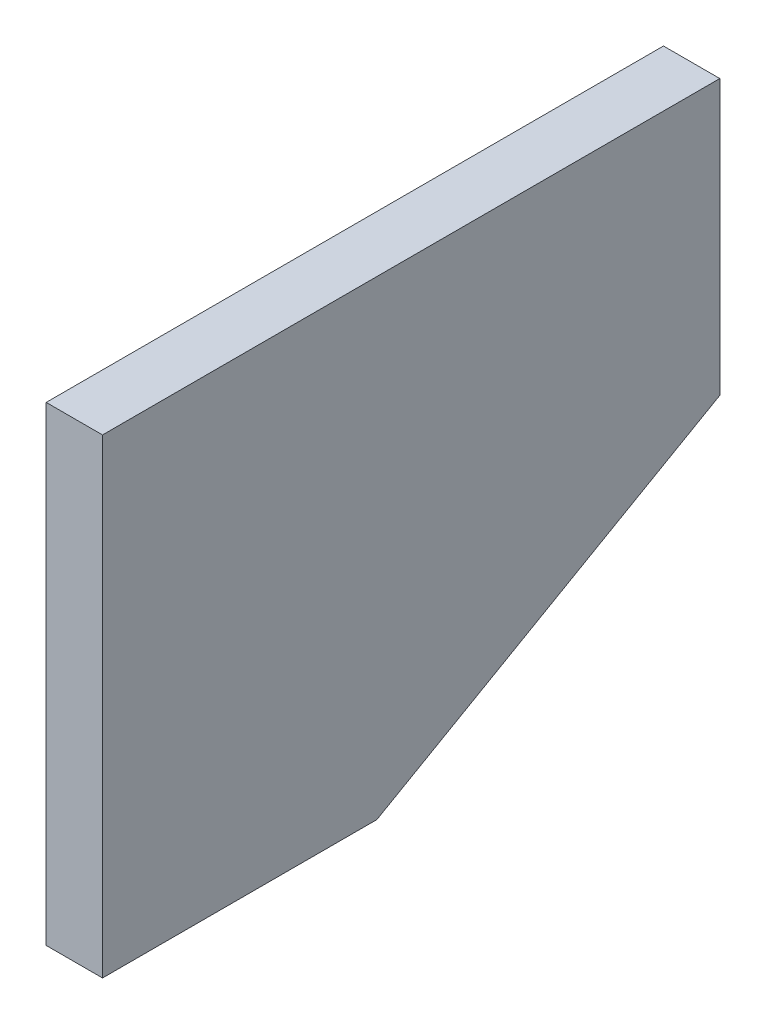
ISO-10303-21;
HEADER;
FILE_DESCRIPTION(('STEP AP214'),'2;1');
FILE_NAME('part.step','',(''),(''),'','','');
FILE_SCHEMA(('AUTOMOTIVE_DESIGN { 1 0 10303 214 1 1 1 1 }'));
ENDSEC;
DATA;
#1=APPLICATION_CONTEXT('core data for automotive mechanical design processes');
#2=APPLICATION_PROTOCOL_DEFINITION('international standard','automotive_design',2000,#1);
#3=PRODUCT_CONTEXT('',#1,'mechanical');
#4=PRODUCT('Part','Part','',(#3));
#5=PRODUCT_RELATED_PRODUCT_CATEGORY('part','',(#4));
#6=PRODUCT_DEFINITION_FORMATION('','',#4);
#7=PRODUCT_DEFINITION_CONTEXT('part definition',#1,'design');
#8=PRODUCT_DEFINITION('design','',#6,#7);
#9=PRODUCT_DEFINITION_SHAPE('','',#8);
#10=(LENGTH_UNIT() NAMED_UNIT(*) SI_UNIT(.MILLI.,.METRE.));
#11=(NAMED_UNIT(*) PLANE_ANGLE_UNIT() SI_UNIT($,.RADIAN.));
#12=(NAMED_UNIT(*) SI_UNIT($,.STERADIAN.) SOLID_ANGLE_UNIT());
#13=UNCERTAINTY_MEASURE_WITH_UNIT(LENGTH_MEASURE(1.E-05),#10,'distance_accuracy_value','');
#14=(GEOMETRIC_REPRESENTATION_CONTEXT(3) GLOBAL_UNCERTAINTY_ASSIGNED_CONTEXT((#13)) GLOBAL_UNIT_ASSIGNED_CONTEXT((#10,
#11,#12)) REPRESENTATION_CONTEXT('',''));
#15=CARTESIAN_POINT('',(0.,0.,0.));
#16=DIRECTION('',(0.,0.,1.));
#17=DIRECTION('',(1.,0.,0.));
#18=AXIS2_PLACEMENT_3D('',#15,#16,#17);
#19=CARTESIAN_POINT('',(18.25625,-152.4,0.));
#20=DIRECTION('',(0.,0.,-1.));
#21=DIRECTION('',(-1.,0.,0.));
#22=AXIS2_PLACEMENT_3D('',#19,#20,#21);
#23=PLANE('',#22);
#24=DIRECTION('',(0.,-1.,0.));
#25=VECTOR('',#24,1.);
#26=CARTESIAN_POINT('',(0.,-152.4,0.));
#27=LINE('',#26,#25);
#28=CARTESIAN_POINT('',(0.,0.,0.));
#29=VERTEX_POINT('',#28);
#30=CARTESIAN_POINT('',(0.,-152.4,0.));
#31=VERTEX_POINT('',#30);
#32=EDGE_CURVE('E107',#29,#31,#27,.T.);
#33=ORIENTED_EDGE('',*,*,#32,.T.);
#34=DIRECTION('',(-1.,0.,0.));
#35=VECTOR('',#34,1.);
#36=CARTESIAN_POINT('',(18.25625,-152.4,0.));
#37=LINE('',#36,#35);
#38=CARTESIAN_POINT('',(18.25625,-152.4,0.));
#39=VERTEX_POINT('',#38);
#40=EDGE_CURVE('E11',#39,#31,#37,.T.);
#41=ORIENTED_EDGE('',*,*,#40,.F.);
#42=DIRECTION('',(0.,-1.,0.));
#43=VECTOR('',#42,1.);
#44=CARTESIAN_POINT('',(18.25625,-152.4,0.));
#45=LINE('',#44,#43);
#46=CARTESIAN_POINT('',(18.25625,0.,0.));
#47=VERTEX_POINT('',#46);
#48=EDGE_CURVE('E115',#47,#39,#45,.T.);
#49=ORIENTED_EDGE('',*,*,#48,.F.);
#50=DIRECTION('',(-1.,0.,0.));
#51=VECTOR('',#50,1.);
#52=CARTESIAN_POINT('',(18.25625,0.,0.));
#53=LINE('',#52,#51);
#54=EDGE_CURVE('E103',#47,#29,#53,.T.);
#55=ORIENTED_EDGE('',*,*,#54,.T.);
#56=EDGE_LOOP('',(#33,#41,#49,#55));
#57=FACE_BOUND('',#56,.T.);
#58=ADVANCED_FACE('F33',(#57),#23,.F.);
#59=CARTESIAN_POINT('',(18.25625,-152.4,-88.9));
#60=DIRECTION('',(0.,1.,0.));
#61=DIRECTION('',(0.,0.,1.));
#62=AXIS2_PLACEMENT_3D('',#59,#60,#61);
#63=PLANE('',#62);
#64=DIRECTION('',(0.,0.,-1.));
#65=VECTOR('',#64,1.);
#66=CARTESIAN_POINT('',(0.,-152.4,-88.9));
#67=LINE('',#66,#65);
#68=CARTESIAN_POINT('',(0.,-152.4,-88.9));
#69=VERTEX_POINT('',#68);
#70=EDGE_CURVE('E110',#31,#69,#67,.T.);
#71=ORIENTED_EDGE('',*,*,#70,.T.);
#72=DIRECTION('',(-1.,0.,0.));
#73=VECTOR('',#72,1.);
#74=CARTESIAN_POINT('',(18.25625,-152.4,-88.9));
#75=LINE('',#74,#73);
#76=CARTESIAN_POINT('',(18.25625,-152.4,-88.9));
#77=VERTEX_POINT('',#76);
#78=EDGE_CURVE('E41',#77,#69,#75,.T.);
#79=ORIENTED_EDGE('',*,*,#78,.F.);
#80=DIRECTION('',(0.,0.,-1.));
#81=VECTOR('',#80,1.);
#82=CARTESIAN_POINT('',(18.25625,-152.4,-88.9));
#83=LINE('',#82,#81);
#84=EDGE_CURVE('E83',#39,#77,#83,.T.);
#85=ORIENTED_EDGE('',*,*,#84,.F.);
#86=ORIENTED_EDGE('',*,*,#40,.T.);
#87=EDGE_LOOP('',(#71,#79,#85,#86));
#88=FACE_BOUND('',#87,.T.);
#89=ADVANCED_FACE('F134',(#88),#63,.F.);
#90=CARTESIAN_POINT('',(18.25625,-88.9,-200.025));
#91=DIRECTION('',(0.,0.868243142124459,0.496138938356834));
#92=DIRECTION('',(0.,-0.496138938356834,0.868243142124459));
#93=AXIS2_PLACEMENT_3D('',#90,#91,#92);
#94=PLANE('',#93);
#95=DIRECTION('',(0.,0.496138938356834,-0.868243142124459));
#96=VECTOR('',#95,1.);
#97=CARTESIAN_POINT('',(0.,-88.9,-200.025));
#98=LINE('',#97,#96);
#99=CARTESIAN_POINT('',(0.,-88.9,-200.025));
#100=VERTEX_POINT('',#99);
#101=EDGE_CURVE('E98',#69,#100,#98,.T.);
#102=ORIENTED_EDGE('',*,*,#101,.T.);
#103=DIRECTION('',(-1.,0.,0.));
#104=VECTOR('',#103,1.);
#105=CARTESIAN_POINT('',(18.25625,-88.9,-200.025));
#106=LINE('',#105,#104);
#107=CARTESIAN_POINT('',(18.25625,-88.9,-200.025));
#108=VERTEX_POINT('',#107);
#109=EDGE_CURVE('E95',#108,#100,#106,.T.);
#110=ORIENTED_EDGE('',*,*,#109,.F.);
#111=DIRECTION('',(0.,0.496138938356834,-0.868243142124459));
#112=VECTOR('',#111,1.);
#113=CARTESIAN_POINT('',(18.25625,-88.9,-200.025));
#114=LINE('',#113,#112);
#115=EDGE_CURVE('E87',#77,#108,#114,.T.);
#116=ORIENTED_EDGE('',*,*,#115,.F.);
#117=ORIENTED_EDGE('',*,*,#78,.T.);
#118=EDGE_LOOP('',(#102,#110,#116,#117));
#119=FACE_BOUND('',#118,.T.);
#120=ADVANCED_FACE('F96',(#119),#94,.F.);
#121=CARTESIAN_POINT('',(18.25625,0.,-200.025));
#122=DIRECTION('',(0.,0.,1.));
#123=DIRECTION('',(1.,0.,0.));
#124=AXIS2_PLACEMENT_3D('',#121,#122,#123);
#125=PLANE('',#124);
#126=DIRECTION('',(0.,1.,0.));
#127=VECTOR('',#126,1.);
#128=CARTESIAN_POINT('',(0.,0.,-200.025));
#129=LINE('',#128,#127);
#130=CARTESIAN_POINT('',(0.,0.,-200.025));
#131=VERTEX_POINT('',#130);
#132=EDGE_CURVE('E69',#100,#131,#129,.T.);
#133=ORIENTED_EDGE('',*,*,#132,.T.);
#134=DIRECTION('',(-1.,0.,0.));
#135=VECTOR('',#134,1.);
#136=CARTESIAN_POINT('',(18.25625,0.,-200.025));
#137=LINE('',#136,#135);
#138=CARTESIAN_POINT('',(18.25625,0.,-200.025));
#139=VERTEX_POINT('',#138);
#140=EDGE_CURVE('E99',#139,#131,#137,.T.);
#141=ORIENTED_EDGE('',*,*,#140,.F.);
#142=DIRECTION('',(0.,1.,0.));
#143=VECTOR('',#142,1.);
#144=CARTESIAN_POINT('',(18.25625,0.,-200.025));
#145=LINE('',#144,#143);
#146=EDGE_CURVE('E91',#108,#139,#145,.T.);
#147=ORIENTED_EDGE('',*,*,#146,.F.);
#148=ORIENTED_EDGE('',*,*,#109,.T.);
#149=EDGE_LOOP('',(#133,#141,#147,#148));
#150=FACE_BOUND('',#149,.T.);
#151=ADVANCED_FACE('F101',(#150),#125,.F.);
#152=CARTESIAN_POINT('',(18.25625,0.,0.));
#153=DIRECTION('',(0.,-1.,0.));
#154=DIRECTION('',(0.,0.,-1.));
#155=AXIS2_PLACEMENT_3D('',#152,#153,#154);
#156=PLANE('',#155);
#157=DIRECTION('',(0.,0.,1.));
#158=VECTOR('',#157,1.);
#159=CARTESIAN_POINT('',(0.,0.,0.));
#160=LINE('',#159,#158);
#161=EDGE_CURVE('E75',#131,#29,#160,.T.);
#162=ORIENTED_EDGE('',*,*,#161,.T.);
#163=ORIENTED_EDGE('',*,*,#54,.F.);
#164=DIRECTION('',(0.,0.,1.));
#165=VECTOR('',#164,1.);
#166=CARTESIAN_POINT('',(18.25625,0.,0.));
#167=LINE('',#166,#165);
#168=EDGE_CURVE('E49',#139,#47,#167,.T.);
#169=ORIENTED_EDGE('',*,*,#168,.F.);
#170=ORIENTED_EDGE('',*,*,#140,.T.);
#171=EDGE_LOOP('',(#162,#163,#169,#170));
#172=FACE_BOUND('',#171,.T.);
#173=ADVANCED_FACE('F123',(#172),#156,.F.);
#174=CARTESIAN_POINT('',(18.25625,0.,0.));
#175=DIRECTION('',(-1.,0.,0.));
#176=DIRECTION('',(0.,0.,1.));
#177=AXIS2_PLACEMENT_3D('',#174,#175,#176);
#178=PLANE('',#177);
#179=ORIENTED_EDGE('',*,*,#48,.T.);
#180=ORIENTED_EDGE('',*,*,#84,.T.);
#181=ORIENTED_EDGE('',*,*,#115,.T.);
#182=ORIENTED_EDGE('',*,*,#146,.T.);
#183=ORIENTED_EDGE('',*,*,#168,.T.);
#184=EDGE_LOOP('',(#179,#180,#181,#182,#183));
#185=FACE_BOUND('',#184,.T.);
#186=ADVANCED_FACE('F89',(#185),#178,.F.);
#187=CARTESIAN_POINT('',(0.,0.,0.));
#188=DIRECTION('',(-1.,0.,0.));
#189=DIRECTION('',(0.,0.,1.));
#190=AXIS2_PLACEMENT_3D('',#187,#188,#189);
#191=PLANE('',#190);
#192=ORIENTED_EDGE('',*,*,#32,.F.);
#193=ORIENTED_EDGE('',*,*,#161,.F.);
#194=ORIENTED_EDGE('',*,*,#132,.F.);
#195=ORIENTED_EDGE('',*,*,#101,.F.);
#196=ORIENTED_EDGE('',*,*,#70,.F.);
#197=EDGE_LOOP('',(#192,#193,#194,#195,#196));
#198=FACE_BOUND('',#197,.T.);
#199=ADVANCED_FACE('F119',(#198),#191,.T.);
#200=CLOSED_SHELL('',(#58,#89,#120,#151,#173,#186,#199));
#201=MANIFOLD_SOLID_BREP('B2',#200);
#202=ADVANCED_BREP_SHAPE_REPRESENTATION('',(#18,#201),#14);
#203=SHAPE_DEFINITION_REPRESENTATION(#9,#202);
ENDSEC;
END-ISO-10303-21;
